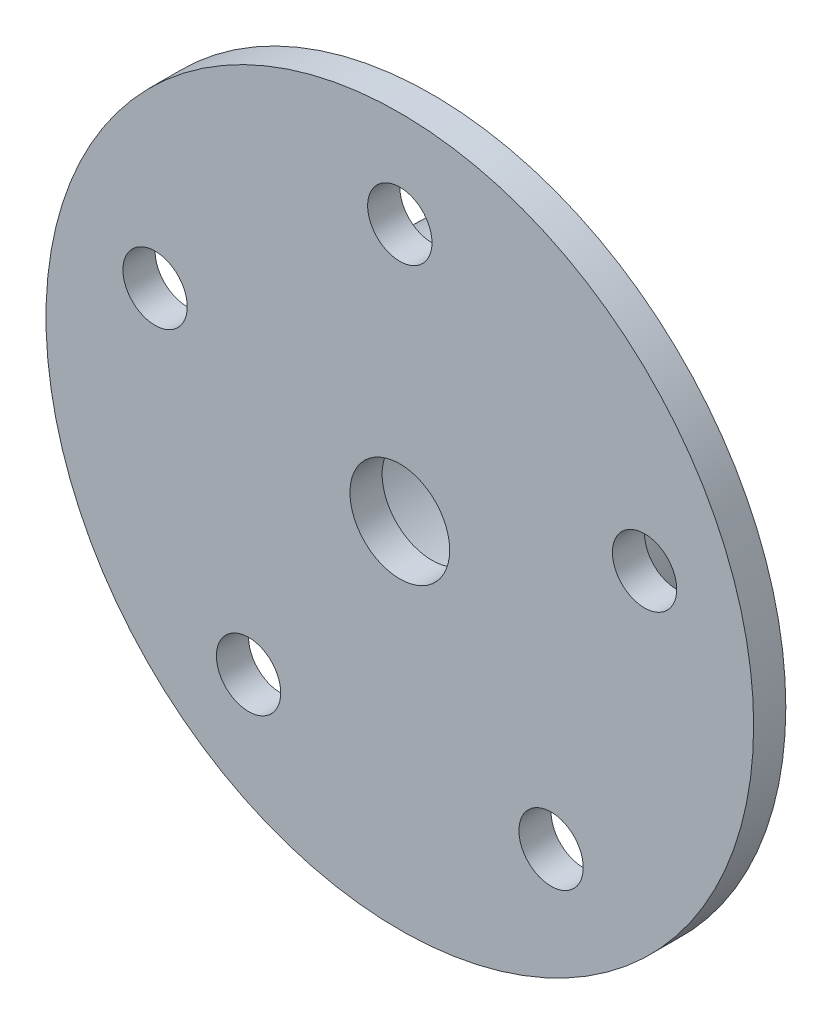
ISO-10303-21;
HEADER;
FILE_DESCRIPTION(('STEP AP214'),'2;1');
FILE_NAME('part.step','',(''),(''),'','','');
FILE_SCHEMA(('AUTOMOTIVE_DESIGN { 1 0 10303 214 1 1 1 1 }'));
ENDSEC;
DATA;
#1=APPLICATION_CONTEXT('core data for automotive mechanical design processes');
#2=APPLICATION_PROTOCOL_DEFINITION('international standard','automotive_design',2000,#1);
#3=PRODUCT_CONTEXT('',#1,'mechanical');
#4=PRODUCT('Part','Part','',(#3));
#5=PRODUCT_RELATED_PRODUCT_CATEGORY('part','',(#4));
#6=PRODUCT_DEFINITION_FORMATION('','',#4);
#7=PRODUCT_DEFINITION_CONTEXT('part definition',#1,'design');
#8=PRODUCT_DEFINITION('design','',#6,#7);
#9=PRODUCT_DEFINITION_SHAPE('','',#8);
#10=(LENGTH_UNIT() NAMED_UNIT(*) SI_UNIT(.MILLI.,.METRE.));
#11=(NAMED_UNIT(*) PLANE_ANGLE_UNIT() SI_UNIT($,.RADIAN.));
#12=(NAMED_UNIT(*) SI_UNIT($,.STERADIAN.) SOLID_ANGLE_UNIT());
#13=UNCERTAINTY_MEASURE_WITH_UNIT(LENGTH_MEASURE(1.E-05),#10,'distance_accuracy_value','');
#14=(GEOMETRIC_REPRESENTATION_CONTEXT(3) GLOBAL_UNCERTAINTY_ASSIGNED_CONTEXT((#13)) GLOBAL_UNIT_ASSIGNED_CONTEXT((#10,
#11,#12)) REPRESENTATION_CONTEXT('',''));
#15=CARTESIAN_POINT('',(0.,0.,0.));
#16=DIRECTION('',(0.,0.,1.));
#17=DIRECTION('',(1.,0.,0.));
#18=AXIS2_PLACEMENT_3D('',#15,#16,#17);
#19=CARTESIAN_POINT('',(0.,0.,0.));
#20=DIRECTION('',(0.,0.,1.));
#21=DIRECTION('',(1.,0.,0.));
#22=AXIS2_PLACEMENT_3D('',#19,#20,#21);
#23=PLANE('',#22);
#24=CARTESIAN_POINT('',(0.,0.,0.));
#25=DIRECTION('',(0.,0.,1.));
#26=DIRECTION('',(1.,0.,0.));
#27=AXIS2_PLACEMENT_3D('',#24,#25,#26);
#28=CIRCLE('',#27,3.1);
#29=CARTESIAN_POINT('',(3.1,0.,0.));
#30=VERTEX_POINT('',#29);
#31=EDGE_CURVE('E65',#30,#30,#28,.T.);
#32=ORIENTED_EDGE('',*,*,#31,.T.);
#33=EDGE_LOOP('',(#32));
#34=FACE_BOUND('',#33,.T.);
#35=CARTESIAN_POINT('',(0.,0.,0.));
#36=DIRECTION('',(0.,0.,-1.));
#37=DIRECTION('',(-1.,0.,0.));
#38=AXIS2_PLACEMENT_3D('',#35,#36,#37);
#39=CIRCLE('',#38,7.6);
#40=CARTESIAN_POINT('',(-7.6,0.,0.));
#41=VERTEX_POINT('',#40);
#42=EDGE_CURVE('E92',#41,#41,#39,.T.);
#43=ORIENTED_EDGE('',*,*,#42,.T.);
#44=EDGE_LOOP('',(#43));
#45=FACE_BOUND('',#44,.T.);
#46=ADVANCED_FACE('F35',(#34,#45),#23,.F.);
#47=CARTESIAN_POINT('',(0.,0.,2.));
#48=DIRECTION('',(0.,0.,1.));
#49=DIRECTION('',(1.,0.,0.));
#50=AXIS2_PLACEMENT_3D('',#47,#48,#49);
#51=PLANE('',#50);
#52=CARTESIAN_POINT('',(-9.40456403667834,-12.9442719099996,2.));
#53=DIRECTION('',(0.,0.,1.));
#54=DIRECTION('',(1.,0.,0.));
#55=AXIS2_PLACEMENT_3D('',#52,#53,#54);
#56=CIRCLE('',#55,2.00000000000142);
#57=CARTESIAN_POINT('',(-7.40456403667692,-12.9442719099996,2.));
#58=VERTEX_POINT('',#57);
#59=EDGE_CURVE('E74',#58,#58,#56,.T.);
#60=ORIENTED_EDGE('',*,*,#59,.F.);
#61=EDGE_LOOP('',(#60));
#62=FACE_BOUND('',#61,.T.);
#63=CARTESIAN_POINT('',(0.,0.,2.));
#64=DIRECTION('',(0.,0.,1.));
#65=DIRECTION('',(1.,0.,0.));
#66=AXIS2_PLACEMENT_3D('',#63,#64,#65);
#67=CIRCLE('',#66,3.1);
#68=CARTESIAN_POINT('',(3.1,0.,2.));
#69=VERTEX_POINT('',#68);
#70=EDGE_CURVE('E62',#69,#69,#67,.T.);
#71=ORIENTED_EDGE('',*,*,#70,.F.);
#72=EDGE_LOOP('',(#71));
#73=FACE_BOUND('',#72,.T.);
#74=CARTESIAN_POINT('',(0.,16.,2.));
#75=DIRECTION('',(0.,0.,1.));
#76=DIRECTION('',(1.,0.,0.));
#77=AXIS2_PLACEMENT_3D('',#74,#75,#76);
#78=CIRCLE('',#77,2.);
#79=CARTESIAN_POINT('',(2.,16.,2.));
#80=VERTEX_POINT('',#79);
#81=EDGE_CURVE('E51',#80,#80,#78,.T.);
#82=ORIENTED_EDGE('',*,*,#81,.F.);
#83=EDGE_LOOP('',(#82));
#84=FACE_BOUND('',#83,.T.);
#85=CARTESIAN_POINT('',(0.,0.,2.));
#86=DIRECTION('',(0.,0.,1.));
#87=DIRECTION('',(1.,0.,0.));
#88=AXIS2_PLACEMENT_3D('',#85,#86,#87);
#89=CIRCLE('',#88,22.);
#90=CARTESIAN_POINT('',(22.,0.,2.));
#91=VERTEX_POINT('',#90);
#92=EDGE_CURVE('E42',#91,#91,#89,.T.);
#93=ORIENTED_EDGE('',*,*,#92,.T.);
#94=EDGE_LOOP('',(#93));
#95=FACE_BOUND('',#94,.T.);
#96=CARTESIAN_POINT('',(15.2169042607229,4.94427190999981,2.));
#97=DIRECTION('',(0.,0.,1.));
#98=DIRECTION('',(1.,0.,0.));
#99=AXIS2_PLACEMENT_3D('',#96,#97,#98);
#100=CIRCLE('',#99,2.00000000000031);
#101=CARTESIAN_POINT('',(17.2169042607232,4.94427190999981,2.));
#102=VERTEX_POINT('',#101);
#103=EDGE_CURVE('E56',#102,#102,#100,.T.);
#104=ORIENTED_EDGE('',*,*,#103,.F.);
#105=EDGE_LOOP('',(#104));
#106=FACE_BOUND('',#105,.T.);
#107=CARTESIAN_POINT('',(9.4045640366808,-12.9442719099988,2.));
#108=DIRECTION('',(0.,0.,1.));
#109=DIRECTION('',(1.,0.,0.));
#110=AXIS2_PLACEMENT_3D('',#107,#108,#109);
#111=CIRCLE('',#110,2.00000000000115);
#112=CARTESIAN_POINT('',(11.4045640366819,-12.9442719099988,2.));
#113=VERTEX_POINT('',#112);
#114=EDGE_CURVE('E68',#113,#113,#111,.T.);
#115=ORIENTED_EDGE('',*,*,#114,.F.);
#116=EDGE_LOOP('',(#115));
#117=FACE_BOUND('',#116,.T.);
#118=CARTESIAN_POINT('',(-15.216904260722,4.94427190999851,2.));
#119=DIRECTION('',(0.,0.,1.));
#120=DIRECTION('',(1.,0.,0.));
#121=AXIS2_PLACEMENT_3D('',#118,#119,#120);
#122=CIRCLE('',#121,2.00000000000081);
#123=CARTESIAN_POINT('',(-13.2169042607212,4.94427190999851,2.));
#124=VERTEX_POINT('',#123);
#125=EDGE_CURVE('E80',#124,#124,#122,.T.);
#126=ORIENTED_EDGE('',*,*,#125,.F.);
#127=EDGE_LOOP('',(#126));
#128=FACE_BOUND('',#127,.T.);
#129=ADVANCED_FACE('F118',(#62,#73,#84,#95,#106,#117,#128),#51,.T.);
#130=CARTESIAN_POINT('',(0.,0.,0.));
#131=DIRECTION('',(0.,0.,1.));
#132=DIRECTION('',(1.,0.,0.));
#133=AXIS2_PLACEMENT_3D('',#130,#131,#132);
#134=CIRCLE('',#133,11.);
#135=CARTESIAN_POINT('',(11.,0.,0.));
#136=VERTEX_POINT('',#135);
#137=EDGE_CURVE('E10',#136,#136,#134,.F.);
#138=ORIENTED_EDGE('',*,*,#137,.F.);
#139=EDGE_LOOP('',(#138));
#140=FACE_BOUND('',#139,.T.);
#141=CARTESIAN_POINT('',(0.,0.,0.));
#142=DIRECTION('',(0.,0.,1.));
#143=DIRECTION('',(1.,0.,0.));
#144=AXIS2_PLACEMENT_3D('',#141,#142,#143);
#145=CIRCLE('',#144,22.);
#146=CARTESIAN_POINT('',(22.,0.,0.));
#147=VERTEX_POINT('',#146);
#148=EDGE_CURVE('E46',#147,#147,#145,.T.);
#149=ORIENTED_EDGE('',*,*,#148,.F.);
#150=EDGE_LOOP('',(#149));
#151=FACE_BOUND('',#150,.T.);
#152=CARTESIAN_POINT('',(0.,16.,0.));
#153=DIRECTION('',(0.,0.,1.));
#154=DIRECTION('',(1.,0.,0.));
#155=AXIS2_PLACEMENT_3D('',#152,#153,#154);
#156=CIRCLE('',#155,2.);
#157=CARTESIAN_POINT('',(2.,16.,0.));
#158=VERTEX_POINT('',#157);
#159=EDGE_CURVE('E53',#158,#158,#156,.T.);
#160=ORIENTED_EDGE('',*,*,#159,.T.);
#161=EDGE_LOOP('',(#160));
#162=FACE_BOUND('',#161,.T.);
#163=CARTESIAN_POINT('',(15.2169042607229,4.94427190999981,0.));
#164=DIRECTION('',(0.,0.,1.));
#165=DIRECTION('',(1.,0.,0.));
#166=AXIS2_PLACEMENT_3D('',#163,#164,#165);
#167=CIRCLE('',#166,2.00000000000031);
#168=CARTESIAN_POINT('',(17.2169042607232,4.94427190999981,0.));
#169=VERTEX_POINT('',#168);
#170=EDGE_CURVE('E59',#169,#169,#167,.T.);
#171=ORIENTED_EDGE('',*,*,#170,.T.);
#172=EDGE_LOOP('',(#171));
#173=FACE_BOUND('',#172,.T.);
#174=CARTESIAN_POINT('',(9.4045640366808,-12.9442719099988,0.));
#175=DIRECTION('',(0.,0.,1.));
#176=DIRECTION('',(1.,0.,0.));
#177=AXIS2_PLACEMENT_3D('',#174,#175,#176);
#178=CIRCLE('',#177,2.00000000000115);
#179=CARTESIAN_POINT('',(11.4045640366819,-12.9442719099988,0.));
#180=VERTEX_POINT('',#179);
#181=EDGE_CURVE('E71',#180,#180,#178,.T.);
#182=ORIENTED_EDGE('',*,*,#181,.T.);
#183=EDGE_LOOP('',(#182));
#184=FACE_BOUND('',#183,.T.);
#185=CARTESIAN_POINT('',(-9.40456403667834,-12.9442719099996,0.));
#186=DIRECTION('',(0.,0.,1.));
#187=DIRECTION('',(1.,0.,0.));
#188=AXIS2_PLACEMENT_3D('',#185,#186,#187);
#189=CIRCLE('',#188,2.00000000000142);
#190=CARTESIAN_POINT('',(-7.40456403667692,-12.9442719099996,0.));
#191=VERTEX_POINT('',#190);
#192=EDGE_CURVE('E77',#191,#191,#189,.T.);
#193=ORIENTED_EDGE('',*,*,#192,.T.);
#194=EDGE_LOOP('',(#193));
#195=FACE_BOUND('',#194,.T.);
#196=CARTESIAN_POINT('',(-15.216904260722,4.94427190999851,0.));
#197=DIRECTION('',(0.,0.,1.));
#198=DIRECTION('',(1.,0.,0.));
#199=AXIS2_PLACEMENT_3D('',#196,#197,#198);
#200=CIRCLE('',#199,2.00000000000081);
#201=CARTESIAN_POINT('',(-13.2169042607212,4.94427190999851,0.));
#202=VERTEX_POINT('',#201);
#203=EDGE_CURVE('E83',#202,#202,#200,.T.);
#204=ORIENTED_EDGE('',*,*,#203,.T.);
#205=EDGE_LOOP('',(#204));
#206=FACE_BOUND('',#205,.T.);
#207=ADVANCED_FACE('F120',(#140,#151,#162,#173,#184,#195,#206),#23,.F.);
#208=CARTESIAN_POINT('',(0.,0.,2.));
#209=DIRECTION('',(0.,0.,-1.));
#210=DIRECTION('',(-1.,0.,0.));
#211=AXIS2_PLACEMENT_3D('',#208,#209,#210);
#212=CYLINDRICAL_SURFACE('',#211,22.);
#213=ORIENTED_EDGE('',*,*,#92,.F.);
#214=EDGE_LOOP('',(#213));
#215=FACE_BOUND('',#214,.T.);
#216=ORIENTED_EDGE('',*,*,#148,.T.);
#217=EDGE_LOOP('',(#216));
#218=FACE_BOUND('',#217,.T.);
#219=ADVANCED_FACE('F37',(#215,#218),#212,.T.);
#220=CARTESIAN_POINT('',(0.,16.,2.));
#221=DIRECTION('',(0.,0.,-1.));
#222=DIRECTION('',(-1.,0.,0.));
#223=AXIS2_PLACEMENT_3D('',#220,#221,#222);
#224=CYLINDRICAL_SURFACE('',#223,2.);
#225=ORIENTED_EDGE('',*,*,#81,.T.);
#226=EDGE_LOOP('',(#225));
#227=FACE_BOUND('',#226,.T.);
#228=ORIENTED_EDGE('',*,*,#159,.F.);
#229=EDGE_LOOP('',(#228));
#230=FACE_BOUND('',#229,.T.);
#231=ADVANCED_FACE('F132',(#227,#230),#224,.F.);
#232=CARTESIAN_POINT('',(15.2169042607229,4.94427190999981,2.));
#233=DIRECTION('',(0.,0.,-1.));
#234=DIRECTION('',(-1.,0.,0.));
#235=AXIS2_PLACEMENT_3D('',#232,#233,#234);
#236=CYLINDRICAL_SURFACE('',#235,2.00000000000031);
#237=ORIENTED_EDGE('',*,*,#103,.T.);
#238=EDGE_LOOP('',(#237));
#239=FACE_BOUND('',#238,.T.);
#240=ORIENTED_EDGE('',*,*,#170,.F.);
#241=EDGE_LOOP('',(#240));
#242=FACE_BOUND('',#241,.T.);
#243=ADVANCED_FACE('F161',(#239,#242),#236,.F.);
#244=CARTESIAN_POINT('',(0.,0.,2.));
#245=DIRECTION('',(0.,0.,-1.));
#246=DIRECTION('',(-1.,0.,0.));
#247=AXIS2_PLACEMENT_3D('',#244,#245,#246);
#248=CYLINDRICAL_SURFACE('',#247,3.1);
#249=ORIENTED_EDGE('',*,*,#70,.T.);
#250=EDGE_LOOP('',(#249));
#251=FACE_BOUND('',#250,.T.);
#252=ORIENTED_EDGE('',*,*,#31,.F.);
#253=EDGE_LOOP('',(#252));
#254=FACE_BOUND('',#253,.T.);
#255=ADVANCED_FACE('F155',(#251,#254),#248,.F.);
#256=CARTESIAN_POINT('',(9.4045640366808,-12.9442719099988,2.));
#257=DIRECTION('',(0.,0.,-1.));
#258=DIRECTION('',(-1.,0.,0.));
#259=AXIS2_PLACEMENT_3D('',#256,#257,#258);
#260=CYLINDRICAL_SURFACE('',#259,2.00000000000115);
#261=ORIENTED_EDGE('',*,*,#114,.T.);
#262=EDGE_LOOP('',(#261));
#263=FACE_BOUND('',#262,.T.);
#264=ORIENTED_EDGE('',*,*,#181,.F.);
#265=EDGE_LOOP('',(#264));
#266=FACE_BOUND('',#265,.T.);
#267=ADVANCED_FACE('F149',(#263,#266),#260,.F.);
#268=CARTESIAN_POINT('',(-9.40456403667834,-12.9442719099996,2.));
#269=DIRECTION('',(0.,0.,-1.));
#270=DIRECTION('',(-1.,0.,0.));
#271=AXIS2_PLACEMENT_3D('',#268,#269,#270);
#272=CYLINDRICAL_SURFACE('',#271,2.00000000000142);
#273=ORIENTED_EDGE('',*,*,#59,.T.);
#274=EDGE_LOOP('',(#273));
#275=FACE_BOUND('',#274,.T.);
#276=ORIENTED_EDGE('',*,*,#192,.F.);
#277=EDGE_LOOP('',(#276));
#278=FACE_BOUND('',#277,.T.);
#279=ADVANCED_FACE('F113',(#275,#278),#272,.F.);
#280=CARTESIAN_POINT('',(-15.216904260722,4.94427190999851,2.));
#281=DIRECTION('',(0.,0.,-1.));
#282=DIRECTION('',(-1.,0.,0.));
#283=AXIS2_PLACEMENT_3D('',#280,#281,#282);
#284=CYLINDRICAL_SURFACE('',#283,2.00000000000081);
#285=ORIENTED_EDGE('',*,*,#125,.T.);
#286=EDGE_LOOP('',(#285));
#287=FACE_BOUND('',#286,.T.);
#288=ORIENTED_EDGE('',*,*,#203,.F.);
#289=EDGE_LOOP('',(#288));
#290=FACE_BOUND('',#289,.T.);
#291=ADVANCED_FACE('F104',(#287,#290),#284,.F.);
#292=CARTESIAN_POINT('',(0.,0.,-7.));
#293=DIRECTION('',(0.,0.,-1.));
#294=DIRECTION('',(-1.,0.,0.));
#295=AXIS2_PLACEMENT_3D('',#292,#293,#294);
#296=PLANE('',#295);
#297=CARTESIAN_POINT('',(0.,0.,-7.));
#298=DIRECTION('',(0.,0.,-1.));
#299=DIRECTION('',(-1.,0.,0.));
#300=AXIS2_PLACEMENT_3D('',#297,#298,#299);
#301=CIRCLE('',#300,11.);
#302=CARTESIAN_POINT('',(-11.,0.,-7.));
#303=VERTEX_POINT('',#302);
#304=EDGE_CURVE('E86',#303,#303,#301,.T.);
#305=ORIENTED_EDGE('',*,*,#304,.T.);
#306=EDGE_LOOP('',(#305));
#307=FACE_BOUND('',#306,.T.);
#308=CARTESIAN_POINT('',(0.,0.,-7.));
#309=DIRECTION('',(0.,0.,-1.));
#310=DIRECTION('',(-1.,0.,0.));
#311=AXIS2_PLACEMENT_3D('',#308,#309,#310);
#312=CIRCLE('',#311,7.6);
#313=CARTESIAN_POINT('',(-7.6,0.,-7.));
#314=VERTEX_POINT('',#313);
#315=EDGE_CURVE('E91',#314,#314,#312,.T.);
#316=ORIENTED_EDGE('',*,*,#315,.F.);
#317=EDGE_LOOP('',(#316));
#318=FACE_BOUND('',#317,.T.);
#319=ADVANCED_FACE('F101',(#307,#318),#296,.T.);
#320=CARTESIAN_POINT('',(0.,0.,-7.));
#321=DIRECTION('',(0.,0.,1.));
#322=DIRECTION('',(1.,0.,0.));
#323=AXIS2_PLACEMENT_3D('',#320,#321,#322);
#324=CYLINDRICAL_SURFACE('',#323,11.);
#325=ORIENTED_EDGE('',*,*,#304,.F.);
#326=EDGE_LOOP('',(#325));
#327=FACE_BOUND('',#326,.T.);
#328=ORIENTED_EDGE('',*,*,#137,.T.);
#329=EDGE_LOOP('',(#328));
#330=FACE_BOUND('',#329,.T.);
#331=ADVANCED_FACE('F103',(#327,#330),#324,.T.);
#332=CARTESIAN_POINT('',(0.,0.,-7.));
#333=DIRECTION('',(0.,0.,1.));
#334=DIRECTION('',(1.,0.,0.));
#335=AXIS2_PLACEMENT_3D('',#332,#333,#334);
#336=CYLINDRICAL_SURFACE('',#335,7.6);
#337=ORIENTED_EDGE('',*,*,#315,.T.);
#338=EDGE_LOOP('',(#337));
#339=FACE_BOUND('',#338,.T.);
#340=ORIENTED_EDGE('',*,*,#42,.F.);
#341=EDGE_LOOP('',(#340));
#342=FACE_BOUND('',#341,.T.);
#343=ADVANCED_FACE('F98',(#339,#342),#336,.F.);
#344=CLOSED_SHELL('',(#46,#129,#207,#219,#231,#243,#255,#267,#279,#291,#319,#331,#343));
#345=MANIFOLD_SOLID_BREP('B2',#344);
#346=ADVANCED_BREP_SHAPE_REPRESENTATION('',(#18,#345),#14);
#347=SHAPE_DEFINITION_REPRESENTATION(#9,#346);
ENDSEC;
END-ISO-10303-21;
